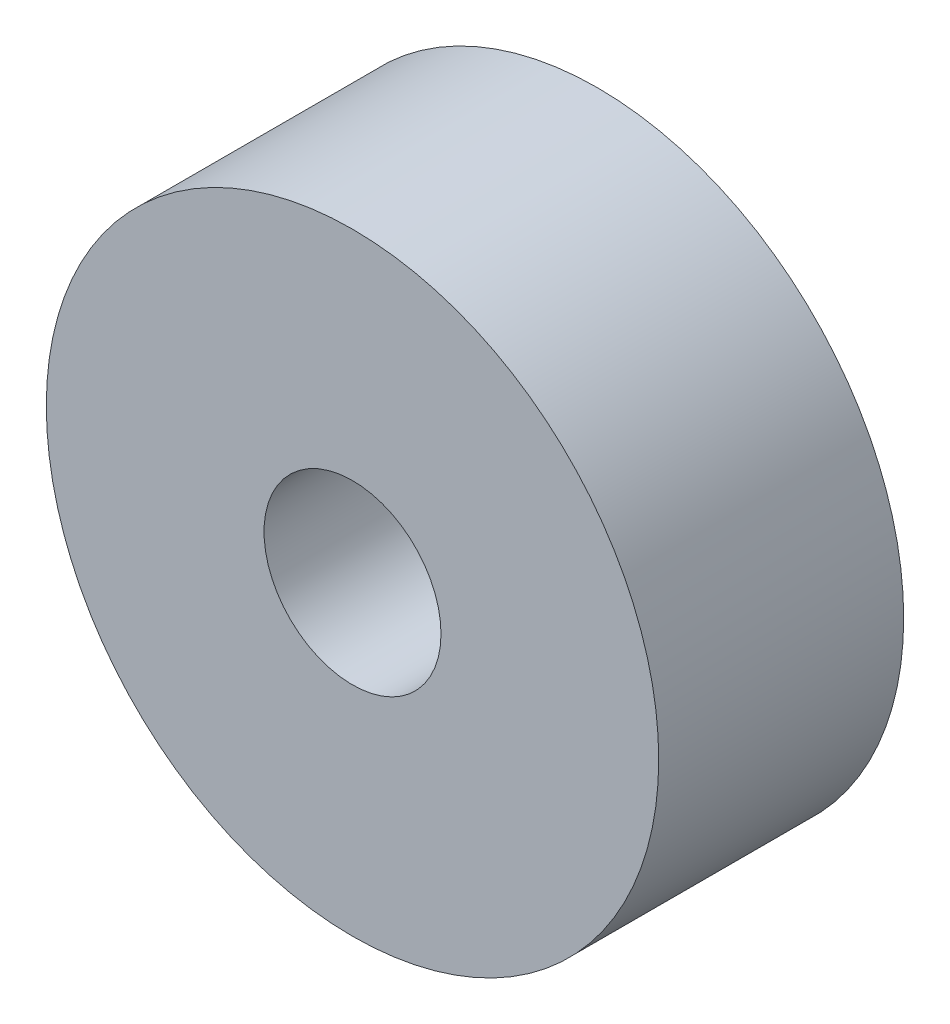
ISO-10303-21;
HEADER;
FILE_DESCRIPTION(('STEP AP214'),'2;1');
FILE_NAME('part.step','',(''),(''),'','','');
FILE_SCHEMA(('AUTOMOTIVE_DESIGN { 1 0 10303 214 1 1 1 1 }'));
ENDSEC;
DATA;
#1=APPLICATION_CONTEXT('core data for automotive mechanical design processes');
#2=APPLICATION_PROTOCOL_DEFINITION('international standard','automotive_design',2000,#1);
#3=PRODUCT_CONTEXT('',#1,'mechanical');
#4=PRODUCT('Part','Part','',(#3));
#5=PRODUCT_RELATED_PRODUCT_CATEGORY('part','',(#4));
#6=PRODUCT_DEFINITION_FORMATION('','',#4);
#7=PRODUCT_DEFINITION_CONTEXT('part definition',#1,'design');
#8=PRODUCT_DEFINITION('design','',#6,#7);
#9=PRODUCT_DEFINITION_SHAPE('','',#8);
#10=(LENGTH_UNIT() NAMED_UNIT(*) SI_UNIT(.MILLI.,.METRE.));
#11=(NAMED_UNIT(*) PLANE_ANGLE_UNIT() SI_UNIT($,.RADIAN.));
#12=(NAMED_UNIT(*) SI_UNIT($,.STERADIAN.) SOLID_ANGLE_UNIT());
#13=UNCERTAINTY_MEASURE_WITH_UNIT(LENGTH_MEASURE(1.E-05),#10,'distance_accuracy_value','');
#14=(GEOMETRIC_REPRESENTATION_CONTEXT(3) GLOBAL_UNCERTAINTY_ASSIGNED_CONTEXT((#13)) GLOBAL_UNIT_ASSIGNED_CONTEXT((#10,
#11,#12)) REPRESENTATION_CONTEXT('',''));
#15=CARTESIAN_POINT('',(0.,0.,0.));
#16=DIRECTION('',(0.,0.,1.));
#17=DIRECTION('',(1.,0.,0.));
#18=AXIS2_PLACEMENT_3D('',#15,#16,#17);
#19=CARTESIAN_POINT('',(-4.07753572367609,1.24956739919106,4.));
#20=DIRECTION('',(0.,0.,1.));
#21=DIRECTION('',(1.,0.,0.));
#22=AXIS2_PLACEMENT_3D('',#19,#20,#21);
#23=PLANE('',#22);
#24=CARTESIAN_POINT('',(-4.07753572367609,1.24956739919106,4.));
#25=DIRECTION('',(0.,0.,1.));
#26=DIRECTION('',(1.,0.,0.));
#27=AXIS2_PLACEMENT_3D('',#24,#25,#26);
#28=CIRCLE('',#27,5.);
#29=CARTESIAN_POINT('',(0.922464276323911,1.24956739919106,4.));
#30=VERTEX_POINT('',#29);
#31=EDGE_CURVE('E10',#30,#30,#28,.T.);
#32=ORIENTED_EDGE('',*,*,#31,.T.);
#33=EDGE_LOOP('',(#32));
#34=FACE_BOUND('',#33,.T.);
#35=CARTESIAN_POINT('',(-4.07753572367609,1.24956739919106,4.));
#36=DIRECTION('',(0.,0.,1.));
#37=DIRECTION('',(1.,0.,0.));
#38=AXIS2_PLACEMENT_3D('',#35,#36,#37);
#39=CIRCLE('',#38,1.445);
#40=CARTESIAN_POINT('',(-2.63253572367609,1.24956739919106,4.));
#41=VERTEX_POINT('',#40);
#42=EDGE_CURVE('E42',#41,#41,#39,.T.);
#43=ORIENTED_EDGE('',*,*,#42,.F.);
#44=EDGE_LOOP('',(#43));
#45=FACE_BOUND('',#44,.T.);
#46=ADVANCED_FACE('F31',(#34,#45),#23,.T.);
#47=CARTESIAN_POINT('',(-4.07753572367609,1.24956739919106,0.));
#48=DIRECTION('',(0.,0.,1.));
#49=DIRECTION('',(1.,0.,0.));
#50=AXIS2_PLACEMENT_3D('',#47,#48,#49);
#51=PLANE('',#50);
#52=CARTESIAN_POINT('',(-4.07753572367609,1.24956739919106,0.));
#53=DIRECTION('',(0.,0.,1.));
#54=DIRECTION('',(1.,0.,0.));
#55=AXIS2_PLACEMENT_3D('',#52,#53,#54);
#56=CIRCLE('',#55,5.);
#57=CARTESIAN_POINT('',(0.922464276323911,1.24956739919106,0.));
#58=VERTEX_POINT('',#57);
#59=EDGE_CURVE('E35',#58,#58,#56,.T.);
#60=ORIENTED_EDGE('',*,*,#59,.F.);
#61=EDGE_LOOP('',(#60));
#62=FACE_BOUND('',#61,.T.);
#63=CARTESIAN_POINT('',(-4.07753572367609,1.24956739919106,0.));
#64=DIRECTION('',(0.,0.,1.));
#65=DIRECTION('',(1.,0.,0.));
#66=AXIS2_PLACEMENT_3D('',#63,#64,#65);
#67=CIRCLE('',#66,1.445);
#68=CARTESIAN_POINT('',(-2.63253572367609,1.24956739919106,0.));
#69=VERTEX_POINT('',#68);
#70=EDGE_CURVE('E44',#69,#69,#67,.T.);
#71=ORIENTED_EDGE('',*,*,#70,.T.);
#72=EDGE_LOOP('',(#71));
#73=FACE_BOUND('',#72,.T.);
#74=ADVANCED_FACE('F54',(#62,#73),#51,.F.);
#75=CARTESIAN_POINT('',(-4.07753572367609,1.24956739919106,4.));
#76=DIRECTION('',(0.,0.,-1.));
#77=DIRECTION('',(-1.,0.,0.));
#78=AXIS2_PLACEMENT_3D('',#75,#76,#77);
#79=CYLINDRICAL_SURFACE('',#78,5.);
#80=ORIENTED_EDGE('',*,*,#31,.F.);
#81=EDGE_LOOP('',(#80));
#82=FACE_BOUND('',#81,.T.);
#83=ORIENTED_EDGE('',*,*,#59,.T.);
#84=EDGE_LOOP('',(#83));
#85=FACE_BOUND('',#84,.T.);
#86=ADVANCED_FACE('F33',(#82,#85),#79,.T.);
#87=CARTESIAN_POINT('',(-4.07753572367609,1.24956739919106,4.));
#88=DIRECTION('',(0.,0.,-1.));
#89=DIRECTION('',(-1.,0.,0.));
#90=AXIS2_PLACEMENT_3D('',#87,#88,#89);
#91=CYLINDRICAL_SURFACE('',#90,1.445);
#92=ORIENTED_EDGE('',*,*,#42,.T.);
#93=EDGE_LOOP('',(#92));
#94=FACE_BOUND('',#93,.T.);
#95=ORIENTED_EDGE('',*,*,#70,.F.);
#96=EDGE_LOOP('',(#95));
#97=FACE_BOUND('',#96,.T.);
#98=ADVANCED_FACE('F50',(#94,#97),#91,.F.);
#99=CLOSED_SHELL('',(#46,#74,#86,#98));
#100=MANIFOLD_SOLID_BREP('B2',#99);
#101=ADVANCED_BREP_SHAPE_REPRESENTATION('',(#18,#100),#14);
#102=SHAPE_DEFINITION_REPRESENTATION(#9,#101);
ENDSEC;
END-ISO-10303-21;
